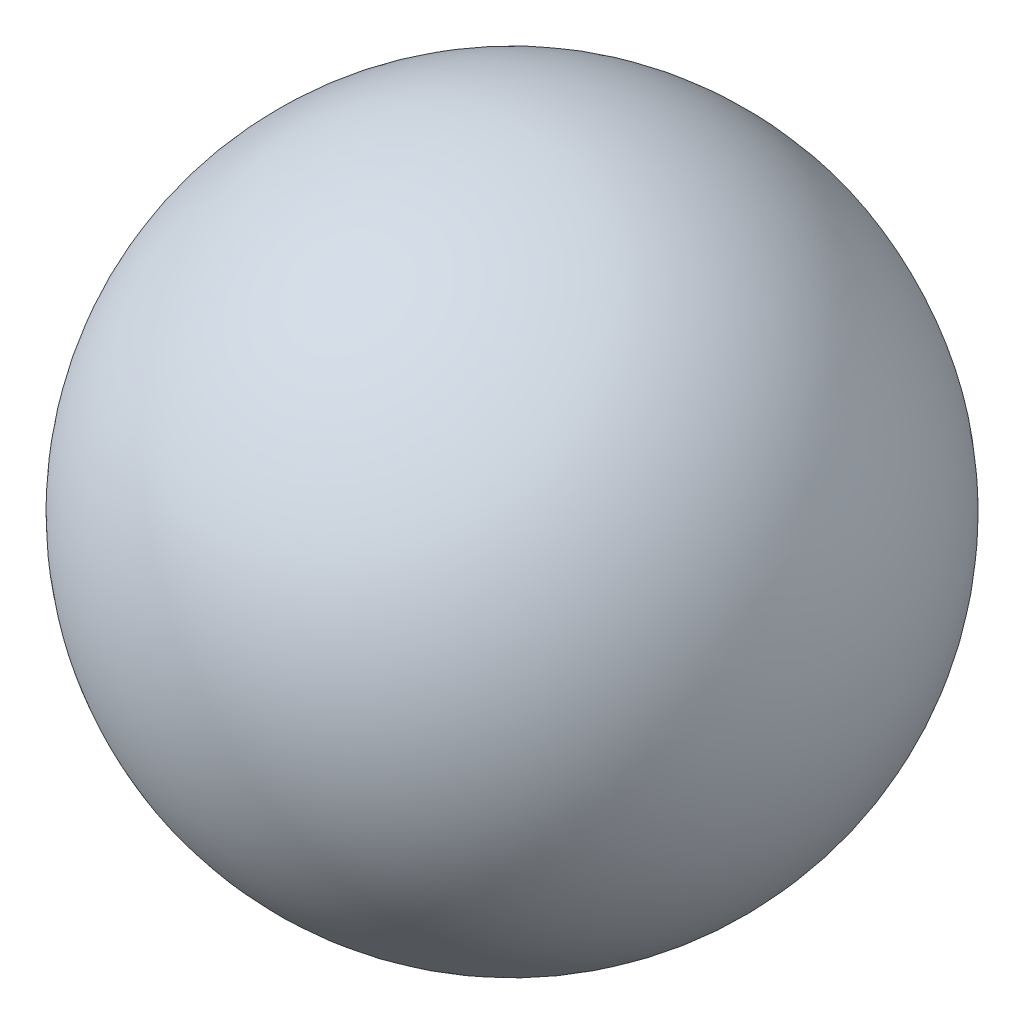
ISO-10303-21;
HEADER;
FILE_DESCRIPTION(('STEP AP214'),'2;1');
FILE_NAME('part.step','',(''),(''),'','','');
FILE_SCHEMA(('AUTOMOTIVE_DESIGN { 1 0 10303 214 1 1 1 1 }'));
ENDSEC;
DATA;
#1=APPLICATION_CONTEXT('core data for automotive mechanical design processes');
#2=APPLICATION_PROTOCOL_DEFINITION('international standard','automotive_design',2000,#1);
#3=PRODUCT_CONTEXT('',#1,'mechanical');
#4=PRODUCT('Part','Part','',(#3));
#5=PRODUCT_RELATED_PRODUCT_CATEGORY('part','',(#4));
#6=PRODUCT_DEFINITION_FORMATION('','',#4);
#7=PRODUCT_DEFINITION_CONTEXT('part definition',#1,'design');
#8=PRODUCT_DEFINITION('design','',#6,#7);
#9=PRODUCT_DEFINITION_SHAPE('','',#8);
#10=(LENGTH_UNIT() NAMED_UNIT(*) SI_UNIT(.MILLI.,.METRE.));
#11=(NAMED_UNIT(*) PLANE_ANGLE_UNIT() SI_UNIT($,.RADIAN.));
#12=(NAMED_UNIT(*) SI_UNIT($,.STERADIAN.) SOLID_ANGLE_UNIT());
#13=UNCERTAINTY_MEASURE_WITH_UNIT(LENGTH_MEASURE(1.E-05),#10,'distance_accuracy_value','');
#14=(GEOMETRIC_REPRESENTATION_CONTEXT(3) GLOBAL_UNCERTAINTY_ASSIGNED_CONTEXT((#13)) GLOBAL_UNIT_ASSIGNED_CONTEXT((#10,
#11,#12)) REPRESENTATION_CONTEXT('',''));
#15=CARTESIAN_POINT('',(0.,0.,0.));
#16=DIRECTION('',(0.,0.,1.));
#17=DIRECTION('',(1.,0.,0.));
#18=AXIS2_PLACEMENT_3D('',#15,#16,#17);
#19=CARTESIAN_POINT('',(0.,0.,45.4649446090432));
#20=DIRECTION('',(0.,0.,-1.));
#21=DIRECTION('',(1.,0.,0.));
#22=AXIS2_PLACEMENT_3D('',#19,#20,#21);
#23=SPHERICAL_SURFACE('',#22,11.341714842274);
#24=CARTESIAN_POINT('',(0.,0.,36.6649178725237));
#25=DIRECTION('',(0.,0.,-1.));
#26=DIRECTION('',(-1.,0.,0.));
#27=AXIS2_PLACEMENT_3D('',#24,#25,#26);
#28=CIRCLE('',#27,7.15499999999999);
#29=CARTESIAN_POINT('',(-7.15499999999999,0.,36.6649178725237));
#30=VERTEX_POINT('',#29);
#31=EDGE_CURVE('E50',#30,#30,#28,.T.);
#32=ORIENTED_EDGE('',*,*,#31,.F.);
#33=EDGE_LOOP('',(#32));
#34=FACE_BOUND('',#33,.T.);
#35=ADVANCED_FACE('F43',(#34),#23,.T.);
#36=CARTESIAN_POINT('',(0.,0.,45.8043014583546));
#37=DIRECTION('',(0.,0.,-1.));
#38=DIRECTION('',(1.,0.,0.));
#39=AXIS2_PLACEMENT_3D('',#36,#37,#38);
#40=SPHERICAL_SURFACE('',#39,10.4872069258655);
#41=CARTESIAN_POINT('',(0.,0.,37.8411811896264));
#42=DIRECTION('',(0.,0.,-1.));
#43=DIRECTION('',(-1.,0.,0.));
#44=AXIS2_PLACEMENT_3D('',#41,#42,#43);
#45=CIRCLE('',#44,6.82423803011669);
#46=CARTESIAN_POINT('',(-6.82423803011669,0.,37.8411811896264));
#47=VERTEX_POINT('',#46);
#48=EDGE_CURVE('E10',#47,#47,#45,.T.);
#49=ORIENTED_EDGE('',*,*,#48,.T.);
#50=EDGE_LOOP('',(#49));
#51=FACE_BOUND('',#50,.T.);
#52=ADVANCED_FACE('F60',(#51),#40,.F.);
#53=CARTESIAN_POINT('',(0.,0.,36.6649178725237));
#54=DIRECTION('',(0.,0.,-1.));
#55=DIRECTION('',(-1.,0.,0.));
#56=AXIS2_PLACEMENT_3D('',#53,#54,#55);
#57=CONICAL_SURFACE('',#56,7.15499999999999,0.274118535548069);
#58=ORIENTED_EDGE('',*,*,#48,.F.);
#59=EDGE_LOOP('',(#58));
#60=FACE_BOUND('',#59,.T.);
#61=ORIENTED_EDGE('',*,*,#31,.T.);
#62=EDGE_LOOP('',(#61));
#63=FACE_BOUND('',#62,.T.);
#64=ADVANCED_FACE('F57',(#60,#63),#57,.F.);
#65=CLOSED_SHELL('',(#35,#52,#64));
#66=MANIFOLD_SOLID_BREP('B2',#65);
#67=ADVANCED_BREP_SHAPE_REPRESENTATION('',(#18,#66),#14);
#68=SHAPE_DEFINITION_REPRESENTATION(#9,#67);
ENDSEC;
END-ISO-10303-21;
